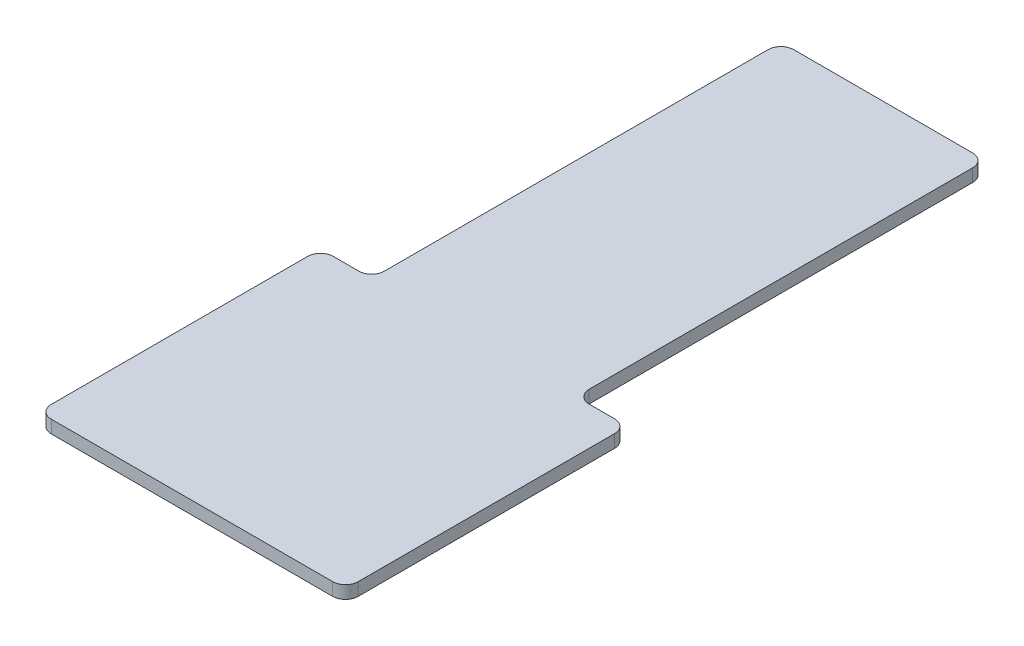
ISO-10303-21;
HEADER;
FILE_DESCRIPTION(('STEP AP214'),'2;1');
FILE_NAME('part.step','',(''),(''),'','','');
FILE_SCHEMA(('AUTOMOTIVE_DESIGN { 1 0 10303 214 1 1 1 1 }'));
ENDSEC;
DATA;
#1=APPLICATION_CONTEXT('core data for automotive mechanical design processes');
#2=APPLICATION_PROTOCOL_DEFINITION('international standard','automotive_design',2000,#1);
#3=PRODUCT_CONTEXT('',#1,'mechanical');
#4=PRODUCT('Part','Part','',(#3));
#5=PRODUCT_RELATED_PRODUCT_CATEGORY('part','',(#4));
#6=PRODUCT_DEFINITION_FORMATION('','',#4);
#7=PRODUCT_DEFINITION_CONTEXT('part definition',#1,'design');
#8=PRODUCT_DEFINITION('design','',#6,#7);
#9=PRODUCT_DEFINITION_SHAPE('','',#8);
#10=(LENGTH_UNIT() NAMED_UNIT(*) SI_UNIT(.MILLI.,.METRE.));
#11=(NAMED_UNIT(*) PLANE_ANGLE_UNIT() SI_UNIT($,.RADIAN.));
#12=(NAMED_UNIT(*) SI_UNIT($,.STERADIAN.) SOLID_ANGLE_UNIT());
#13=UNCERTAINTY_MEASURE_WITH_UNIT(LENGTH_MEASURE(1.E-05),#10,'distance_accuracy_value','');
#14=(GEOMETRIC_REPRESENTATION_CONTEXT(3) GLOBAL_UNCERTAINTY_ASSIGNED_CONTEXT((#13)) GLOBAL_UNIT_ASSIGNED_CONTEXT((#10,
#11,#12)) REPRESENTATION_CONTEXT('',''));
#15=CARTESIAN_POINT('',(0.,0.,0.));
#16=DIRECTION('',(0.,0.,1.));
#17=DIRECTION('',(1.,0.,0.));
#18=AXIS2_PLACEMENT_3D('',#15,#16,#17);
#19=CARTESIAN_POINT('',(0.,3.175,0.));
#20=DIRECTION('',(1.,0.,0.));
#21=DIRECTION('',(0.,0.,-1.));
#22=AXIS2_PLACEMENT_3D('',#19,#20,#21);
#23=PLANE('',#22);
#24=DIRECTION('',(0.,0.,1.));
#25=VECTOR('',#24,1.);
#26=CARTESIAN_POINT('',(0.,3.175,0.));
#27=LINE('',#26,#25);
#28=CARTESIAN_POINT('',(0.,3.175,-66.825));
#29=VERTEX_POINT('',#28);
#30=CARTESIAN_POINT('',(0.,3.175,-3.175));
#31=VERTEX_POINT('',#30);
#32=EDGE_CURVE('E172',#29,#31,#27,.T.);
#33=ORIENTED_EDGE('',*,*,#32,.F.);
#34=DIRECTION('',(0.,-1.,0.));
#35=VECTOR('',#34,1.);
#36=CARTESIAN_POINT('',(0.,3.175,-66.825));
#37=LINE('',#36,#35);
#38=CARTESIAN_POINT('',(0.,0.,-66.825));
#39=VERTEX_POINT('',#38);
#40=EDGE_CURVE('E157',#29,#39,#37,.T.);
#41=ORIENTED_EDGE('',*,*,#40,.T.);
#42=DIRECTION('',(0.,0.,1.));
#43=VECTOR('',#42,1.);
#44=CARTESIAN_POINT('',(0.,0.,0.));
#45=LINE('',#44,#43);
#46=CARTESIAN_POINT('',(0.,0.,-3.175));
#47=VERTEX_POINT('',#46);
#48=EDGE_CURVE('E169',#39,#47,#45,.T.);
#49=ORIENTED_EDGE('',*,*,#48,.T.);
#50=DIRECTION('',(0.,-1.,0.));
#51=VECTOR('',#50,1.);
#52=CARTESIAN_POINT('',(0.,3.175,-3.175));
#53=LINE('',#52,#51);
#54=EDGE_CURVE('E174',#47,#31,#53,.F.);
#55=ORIENTED_EDGE('',*,*,#54,.T.);
#56=EDGE_LOOP('',(#33,#41,#49,#55));
#57=FACE_BOUND('',#56,.T.);
#58=ADVANCED_FACE('F39',(#57),#23,.F.);
#59=CARTESIAN_POINT('',(0.,3.175,0.));
#60=DIRECTION('',(0.,0.,-1.));
#61=DIRECTION('',(-1.,0.,0.));
#62=AXIS2_PLACEMENT_3D('',#59,#60,#61);
#63=PLANE('',#62);
#64=DIRECTION('',(1.,0.,0.));
#65=VECTOR('',#64,1.);
#66=CARTESIAN_POINT('',(0.,0.,0.));
#67=LINE('',#66,#65);
#68=CARTESIAN_POINT('',(3.175,0.,0.));
#69=VERTEX_POINT('',#68);
#70=CARTESIAN_POINT('',(73.025,0.,0.));
#71=VERTEX_POINT('',#70);
#72=EDGE_CURVE('E179',#69,#71,#67,.T.);
#73=ORIENTED_EDGE('',*,*,#72,.T.);
#74=DIRECTION('',(0.,-1.,0.));
#75=VECTOR('',#74,1.);
#76=CARTESIAN_POINT('',(73.025,3.175,0.));
#77=LINE('',#76,#75);
#78=CARTESIAN_POINT('',(73.025,3.175,0.));
#79=VERTEX_POINT('',#78);
#80=EDGE_CURVE('E252',#71,#79,#77,.F.);
#81=ORIENTED_EDGE('',*,*,#80,.T.);
#82=DIRECTION('',(1.,0.,0.));
#83=VECTOR('',#82,1.);
#84=CARTESIAN_POINT('',(0.,3.175,0.));
#85=LINE('',#84,#83);
#86=CARTESIAN_POINT('',(3.175,3.175,0.));
#87=VERTEX_POINT('',#86);
#88=EDGE_CURVE('E387',#87,#79,#85,.T.);
#89=ORIENTED_EDGE('',*,*,#88,.F.);
#90=DIRECTION('',(0.,-1.,0.));
#91=VECTOR('',#90,1.);
#92=CARTESIAN_POINT('',(3.175,3.175,0.));
#93=LINE('',#92,#91);
#94=EDGE_CURVE('E249',#87,#69,#93,.T.);
#95=ORIENTED_EDGE('',*,*,#94,.T.);
#96=EDGE_LOOP('',(#73,#81,#89,#95));
#97=FACE_BOUND('',#96,.T.);
#98=ADVANCED_FACE('F316',(#97),#63,.F.);
#99=CARTESIAN_POINT('',(76.2,3.175,0.));
#100=DIRECTION('',(-1.,0.,0.));
#101=DIRECTION('',(0.,0.,1.));
#102=AXIS2_PLACEMENT_3D('',#99,#100,#101);
#103=PLANE('',#102);
#104=DIRECTION('',(0.,0.,-1.));
#105=VECTOR('',#104,1.);
#106=CARTESIAN_POINT('',(76.2,3.175,0.));
#107=LINE('',#106,#105);
#108=CARTESIAN_POINT('',(76.2,3.175,-3.175));
#109=VERTEX_POINT('',#108);
#110=CARTESIAN_POINT('',(76.2,3.175,-66.825));
#111=VERTEX_POINT('',#110);
#112=EDGE_CURVE('E283',#109,#111,#107,.T.);
#113=ORIENTED_EDGE('',*,*,#112,.F.);
#114=DIRECTION('',(0.,-1.,0.));
#115=VECTOR('',#114,1.);
#116=CARTESIAN_POINT('',(76.2,3.175,-3.175));
#117=LINE('',#116,#115);
#118=CARTESIAN_POINT('',(76.2,0.,-3.175));
#119=VERTEX_POINT('',#118);
#120=EDGE_CURVE('E246',#109,#119,#117,.T.);
#121=ORIENTED_EDGE('',*,*,#120,.T.);
#122=DIRECTION('',(0.,0.,-1.));
#123=VECTOR('',#122,1.);
#124=CARTESIAN_POINT('',(76.2,0.,0.));
#125=LINE('',#124,#123);
#126=CARTESIAN_POINT('',(76.2,0.,-66.825));
#127=VERTEX_POINT('',#126);
#128=EDGE_CURVE('E182',#119,#127,#125,.T.);
#129=ORIENTED_EDGE('',*,*,#128,.T.);
#130=DIRECTION('',(0.,-1.,0.));
#131=VECTOR('',#130,1.);
#132=CARTESIAN_POINT('',(76.2,3.175,-66.825));
#133=LINE('',#132,#131);
#134=EDGE_CURVE('E244',#127,#111,#133,.F.);
#135=ORIENTED_EDGE('',*,*,#134,.T.);
#136=EDGE_LOOP('',(#113,#121,#129,#135));
#137=FACE_BOUND('',#136,.T.);
#138=ADVANCED_FACE('F321',(#137),#103,.F.);
#139=CARTESIAN_POINT('',(63.5,3.175,-70.));
#140=DIRECTION('',(0.,0.,1.));
#141=DIRECTION('',(1.,0.,0.));
#142=AXIS2_PLACEMENT_3D('',#139,#140,#141);
#143=PLANE('',#142);
#144=DIRECTION('',(-1.,0.,0.));
#145=VECTOR('',#144,1.);
#146=CARTESIAN_POINT('',(63.5,0.,-70.));
#147=LINE('',#146,#145);
#148=CARTESIAN_POINT('',(73.025,0.,-70.));
#149=VERTEX_POINT('',#148);
#150=CARTESIAN_POINT('',(66.675,0.,-70.));
#151=VERTEX_POINT('',#150);
#152=EDGE_CURVE('E190',#149,#151,#147,.T.);
#153=ORIENTED_EDGE('',*,*,#152,.T.);
#154=DIRECTION('',(0.,-1.,0.));
#155=VECTOR('',#154,1.);
#156=CARTESIAN_POINT('',(66.675,3.175,-70.));
#157=LINE('',#156,#155);
#158=CARTESIAN_POINT('',(66.675,3.175,-70.));
#159=VERTEX_POINT('',#158);
#160=EDGE_CURVE('E242',#151,#159,#157,.F.);
#161=ORIENTED_EDGE('',*,*,#160,.T.);
#162=DIRECTION('',(-1.,0.,0.));
#163=VECTOR('',#162,1.);
#164=CARTESIAN_POINT('',(63.5,3.175,-70.));
#165=LINE('',#164,#163);
#166=CARTESIAN_POINT('',(73.025,3.175,-70.));
#167=VERTEX_POINT('',#166);
#168=EDGE_CURVE('E275',#167,#159,#165,.T.);
#169=ORIENTED_EDGE('',*,*,#168,.F.);
#170=DIRECTION('',(0.,-1.,0.));
#171=VECTOR('',#170,1.);
#172=CARTESIAN_POINT('',(73.025,3.175,-70.));
#173=LINE('',#172,#171);
#174=EDGE_CURVE('E239',#167,#149,#173,.T.);
#175=ORIENTED_EDGE('',*,*,#174,.T.);
#176=EDGE_LOOP('',(#153,#161,#169,#175));
#177=FACE_BOUND('',#176,.T.);
#178=ADVANCED_FACE('F263',(#177),#143,.F.);
#179=CARTESIAN_POINT('',(63.5,3.175,-70.));
#180=DIRECTION('',(-1.,0.,0.));
#181=DIRECTION('',(0.,0.,1.));
#182=AXIS2_PLACEMENT_3D('',#179,#180,#181);
#183=PLANE('',#182);
#184=DIRECTION('',(0.,0.,-1.));
#185=VECTOR('',#184,1.);
#186=CARTESIAN_POINT('',(63.5,0.,-70.));
#187=LINE('',#186,#185);
#188=CARTESIAN_POINT('',(63.5,0.,-73.175));
#189=VERTEX_POINT('',#188);
#190=CARTESIAN_POINT('',(63.5,0.,-168.425));
#191=VERTEX_POINT('',#190);
#192=EDGE_CURVE('E193',#189,#191,#187,.T.);
#193=ORIENTED_EDGE('',*,*,#192,.T.);
#194=DIRECTION('',(0.,-1.,0.));
#195=VECTOR('',#194,1.);
#196=CARTESIAN_POINT('',(63.5,3.175,-168.425));
#197=LINE('',#196,#195);
#198=CARTESIAN_POINT('',(63.5,3.175,-168.425));
#199=VERTEX_POINT('',#198);
#200=EDGE_CURVE('E237',#191,#199,#197,.F.);
#201=ORIENTED_EDGE('',*,*,#200,.T.);
#202=DIRECTION('',(0.,0.,-1.));
#203=VECTOR('',#202,1.);
#204=CARTESIAN_POINT('',(63.5,3.175,-70.));
#205=LINE('',#204,#203);
#206=CARTESIAN_POINT('',(63.5,3.175,-73.175));
#207=VERTEX_POINT('',#206);
#208=EDGE_CURVE('E273',#207,#199,#205,.T.);
#209=ORIENTED_EDGE('',*,*,#208,.F.);
#210=DIRECTION('',(0.,-1.,0.));
#211=VECTOR('',#210,1.);
#212=CARTESIAN_POINT('',(63.5,0.,-73.175));
#213=LINE('',#212,#211);
#214=EDGE_CURVE('E234',#207,#189,#213,.T.);
#215=ORIENTED_EDGE('',*,*,#214,.T.);
#216=EDGE_LOOP('',(#193,#201,#209,#215));
#217=FACE_BOUND('',#216,.T.);
#218=ADVANCED_FACE('F277',(#217),#183,.F.);
#219=CARTESIAN_POINT('',(12.7,3.175,-171.6));
#220=DIRECTION('',(0.,0.,1.));
#221=DIRECTION('',(1.,0.,0.));
#222=AXIS2_PLACEMENT_3D('',#219,#220,#221);
#223=PLANE('',#222);
#224=DIRECTION('',(-1.,0.,0.));
#225=VECTOR('',#224,1.);
#226=CARTESIAN_POINT('',(12.7,0.,-171.6));
#227=LINE('',#226,#225);
#228=CARTESIAN_POINT('',(60.325,0.,-171.6));
#229=VERTEX_POINT('',#228);
#230=CARTESIAN_POINT('',(15.875,0.,-171.6));
#231=VERTEX_POINT('',#230);
#232=EDGE_CURVE('E196',#229,#231,#227,.T.);
#233=ORIENTED_EDGE('',*,*,#232,.T.);
#234=DIRECTION('',(0.,-1.,0.));
#235=VECTOR('',#234,1.);
#236=CARTESIAN_POINT('',(15.875,3.175,-171.6));
#237=LINE('',#236,#235);
#238=CARTESIAN_POINT('',(15.875,3.175,-171.6));
#239=VERTEX_POINT('',#238);
#240=EDGE_CURVE('E232',#231,#239,#237,.F.);
#241=ORIENTED_EDGE('',*,*,#240,.T.);
#242=DIRECTION('',(-1.,0.,0.));
#243=VECTOR('',#242,1.);
#244=CARTESIAN_POINT('',(12.7,3.175,-171.6));
#245=LINE('',#244,#243);
#246=CARTESIAN_POINT('',(60.325,3.175,-171.6));
#247=VERTEX_POINT('',#246);
#248=EDGE_CURVE('E279',#247,#239,#245,.T.);
#249=ORIENTED_EDGE('',*,*,#248,.F.);
#250=DIRECTION('',(0.,-1.,0.));
#251=VECTOR('',#250,1.);
#252=CARTESIAN_POINT('',(60.325,3.175,-171.6));
#253=LINE('',#252,#251);
#254=EDGE_CURVE('E229',#247,#229,#253,.T.);
#255=ORIENTED_EDGE('',*,*,#254,.T.);
#256=EDGE_LOOP('',(#233,#241,#249,#255));
#257=FACE_BOUND('',#256,.T.);
#258=ADVANCED_FACE('F301',(#257),#223,.F.);
#259=CARTESIAN_POINT('',(12.7,3.175,-70.));
#260=DIRECTION('',(1.,0.,0.));
#261=DIRECTION('',(0.,0.,-1.));
#262=AXIS2_PLACEMENT_3D('',#259,#260,#261);
#263=PLANE('',#262);
#264=DIRECTION('',(0.,0.,1.));
#265=VECTOR('',#264,1.);
#266=CARTESIAN_POINT('',(12.7,0.,-70.));
#267=LINE('',#266,#265);
#268=CARTESIAN_POINT('',(12.7,0.,-168.425));
#269=VERTEX_POINT('',#268);
#270=CARTESIAN_POINT('',(12.7,0.,-73.175));
#271=VERTEX_POINT('',#270);
#272=EDGE_CURVE('E199',#269,#271,#267,.T.);
#273=ORIENTED_EDGE('',*,*,#272,.T.);
#274=DIRECTION('',(0.,-1.,0.));
#275=VECTOR('',#274,1.);
#276=CARTESIAN_POINT('',(12.7,3.175,-73.175));
#277=LINE('',#276,#275);
#278=CARTESIAN_POINT('',(12.7,3.175,-73.175));
#279=VERTEX_POINT('',#278);
#280=EDGE_CURVE('E54',#271,#279,#277,.F.);
#281=ORIENTED_EDGE('',*,*,#280,.T.);
#282=DIRECTION('',(0.,0.,1.));
#283=VECTOR('',#282,1.);
#284=CARTESIAN_POINT('',(12.7,3.175,-70.));
#285=LINE('',#284,#283);
#286=CARTESIAN_POINT('',(12.7,3.175,-168.425));
#287=VERTEX_POINT('',#286);
#288=EDGE_CURVE('E281',#287,#279,#285,.T.);
#289=ORIENTED_EDGE('',*,*,#288,.F.);
#290=DIRECTION('',(0.,-1.,0.));
#291=VECTOR('',#290,1.);
#292=CARTESIAN_POINT('',(12.7,3.175,-168.425));
#293=LINE('',#292,#291);
#294=EDGE_CURVE('E225',#287,#269,#293,.T.);
#295=ORIENTED_EDGE('',*,*,#294,.T.);
#296=EDGE_LOOP('',(#273,#281,#289,#295));
#297=FACE_BOUND('',#296,.T.);
#298=ADVANCED_FACE('F294',(#297),#263,.F.);
#299=CARTESIAN_POINT('',(0.,3.175,-70.));
#300=DIRECTION('',(0.,0.,1.));
#301=DIRECTION('',(1.,0.,0.));
#302=AXIS2_PLACEMENT_3D('',#299,#300,#301);
#303=PLANE('',#302);
#304=DIRECTION('',(-1.,0.,0.));
#305=VECTOR('',#304,1.);
#306=CARTESIAN_POINT('',(0.,0.,-70.));
#307=LINE('',#306,#305);
#308=CARTESIAN_POINT('',(9.525,0.,-70.));
#309=VERTEX_POINT('',#308);
#310=CARTESIAN_POINT('',(3.175,0.,-70.));
#311=VERTEX_POINT('',#310);
#312=EDGE_CURVE('E201',#309,#311,#307,.T.);
#313=ORIENTED_EDGE('',*,*,#312,.T.);
#314=DIRECTION('',(0.,-1.,0.));
#315=VECTOR('',#314,1.);
#316=CARTESIAN_POINT('',(3.175,3.175,-70.));
#317=LINE('',#316,#315);
#318=CARTESIAN_POINT('',(3.175,3.175,-70.));
#319=VERTEX_POINT('',#318);
#320=EDGE_CURVE('E158',#311,#319,#317,.F.);
#321=ORIENTED_EDGE('',*,*,#320,.T.);
#322=DIRECTION('',(-1.,0.,0.));
#323=VECTOR('',#322,1.);
#324=CARTESIAN_POINT('',(0.,3.175,-70.));
#325=LINE('',#324,#323);
#326=CARTESIAN_POINT('',(9.525,3.175,-70.));
#327=VERTEX_POINT('',#326);
#328=EDGE_CURVE('E185',#327,#319,#325,.T.);
#329=ORIENTED_EDGE('',*,*,#328,.F.);
#330=DIRECTION('',(0.,-1.,0.));
#331=VECTOR('',#330,1.);
#332=CARTESIAN_POINT('',(9.525,0.,-70.));
#333=LINE('',#332,#331);
#334=EDGE_CURVE('E163',#327,#309,#333,.T.);
#335=ORIENTED_EDGE('',*,*,#334,.T.);
#336=EDGE_LOOP('',(#313,#321,#329,#335));
#337=FACE_BOUND('',#336,.T.);
#338=ADVANCED_FACE('F290',(#337),#303,.F.);
#339=CARTESIAN_POINT('',(0.,3.175,0.));
#340=DIRECTION('',(0.,-1.,0.));
#341=DIRECTION('',(0.,0.,-1.));
#342=AXIS2_PLACEMENT_3D('',#339,#340,#341);
#343=PLANE('',#342);
#344=ORIENTED_EDGE('',*,*,#328,.T.);
#345=CARTESIAN_POINT('',(3.175,3.175,-66.825));
#346=DIRECTION('',(0.,-1.,0.));
#347=DIRECTION('',(0.,0.,-1.));
#348=AXIS2_PLACEMENT_3D('',#345,#346,#347);
#349=CIRCLE('',#348,3.175);
#350=EDGE_CURVE('E223',#319,#29,#349,.F.);
#351=ORIENTED_EDGE('',*,*,#350,.T.);
#352=ORIENTED_EDGE('',*,*,#32,.T.);
#353=CARTESIAN_POINT('',(3.175,3.175,-3.175));
#354=DIRECTION('',(0.,-1.,0.));
#355=DIRECTION('',(0.,0.,-1.));
#356=AXIS2_PLACEMENT_3D('',#353,#354,#355);
#357=CIRCLE('',#356,3.175);
#358=EDGE_CURVE('E216',#31,#87,#357,.F.);
#359=ORIENTED_EDGE('',*,*,#358,.T.);
#360=ORIENTED_EDGE('',*,*,#88,.T.);
#361=CARTESIAN_POINT('',(73.025,3.175,-3.175));
#362=DIRECTION('',(0.,-1.,0.));
#363=DIRECTION('',(0.,0.,-1.));
#364=AXIS2_PLACEMENT_3D('',#361,#362,#363);
#365=CIRCLE('',#364,3.175);
#366=EDGE_CURVE('E218',#79,#109,#365,.F.);
#367=ORIENTED_EDGE('',*,*,#366,.T.);
#368=ORIENTED_EDGE('',*,*,#112,.T.);
#369=CARTESIAN_POINT('',(73.025,3.175,-66.825));
#370=DIRECTION('',(0.,-1.,0.));
#371=DIRECTION('',(0.,0.,-1.));
#372=AXIS2_PLACEMENT_3D('',#369,#370,#371);
#373=CIRCLE('',#372,3.175);
#374=EDGE_CURVE('E214',#111,#167,#373,.F.);
#375=ORIENTED_EDGE('',*,*,#374,.T.);
#376=ORIENTED_EDGE('',*,*,#168,.T.);
#377=CARTESIAN_POINT('',(66.675,3.175,-73.175));
#378=DIRECTION('',(0.,-1.,0.));
#379=DIRECTION('',(0.,0.,-1.));
#380=AXIS2_PLACEMENT_3D('',#377,#378,#379);
#381=CIRCLE('',#380,3.175);
#382=EDGE_CURVE('E11',#159,#207,#381,.T.);
#383=ORIENTED_EDGE('',*,*,#382,.T.);
#384=ORIENTED_EDGE('',*,*,#208,.T.);
#385=CARTESIAN_POINT('',(60.325,3.175,-168.425));
#386=DIRECTION('',(0.,-1.,0.));
#387=DIRECTION('',(0.,0.,-1.));
#388=AXIS2_PLACEMENT_3D('',#385,#386,#387);
#389=CIRCLE('',#388,3.175);
#390=EDGE_CURVE('E220',#199,#247,#389,.F.);
#391=ORIENTED_EDGE('',*,*,#390,.T.);
#392=ORIENTED_EDGE('',*,*,#248,.T.);
#393=CARTESIAN_POINT('',(15.875,3.175,-168.425));
#394=DIRECTION('',(0.,-1.,0.));
#395=DIRECTION('',(0.,0.,-1.));
#396=AXIS2_PLACEMENT_3D('',#393,#394,#395);
#397=CIRCLE('',#396,3.175);
#398=EDGE_CURVE('E61',#239,#287,#397,.F.);
#399=ORIENTED_EDGE('',*,*,#398,.T.);
#400=ORIENTED_EDGE('',*,*,#288,.T.);
#401=CARTESIAN_POINT('',(9.525,3.175,-73.175));
#402=DIRECTION('',(0.,-1.,0.));
#403=DIRECTION('',(0.,0.,-1.));
#404=AXIS2_PLACEMENT_3D('',#401,#402,#403);
#405=CIRCLE('',#404,3.175);
#406=EDGE_CURVE('E256',#279,#327,#405,.T.);
#407=ORIENTED_EDGE('',*,*,#406,.T.);
#408=EDGE_LOOP('',(#344,#351,#352,#359,#360,#367,#368,#375,#376,#383,#384,#391,#392,#399,#400,#407));
#409=FACE_BOUND('',#408,.T.);
#410=ADVANCED_FACE('F272',(#409),#343,.F.);
#411=CARTESIAN_POINT('',(0.,0.,0.));
#412=DIRECTION('',(0.,-1.,0.));
#413=DIRECTION('',(0.,0.,-1.));
#414=AXIS2_PLACEMENT_3D('',#411,#412,#413);
#415=PLANE('',#414);
#416=ORIENTED_EDGE('',*,*,#48,.F.);
#417=CARTESIAN_POINT('',(3.175,0.,-66.825));
#418=DIRECTION('',(0.,-1.,0.));
#419=DIRECTION('',(0.,0.,-1.));
#420=AXIS2_PLACEMENT_3D('',#417,#418,#419);
#421=CIRCLE('',#420,3.175);
#422=EDGE_CURVE('E153',#39,#311,#421,.T.);
#423=ORIENTED_EDGE('',*,*,#422,.T.);
#424=ORIENTED_EDGE('',*,*,#312,.F.);
#425=CARTESIAN_POINT('',(9.525,0.,-73.175));
#426=DIRECTION('',(0.,-1.,0.));
#427=DIRECTION('',(0.,0.,-1.));
#428=AXIS2_PLACEMENT_3D('',#425,#426,#427);
#429=CIRCLE('',#428,3.175);
#430=EDGE_CURVE('E254',#309,#271,#429,.F.);
#431=ORIENTED_EDGE('',*,*,#430,.T.);
#432=ORIENTED_EDGE('',*,*,#272,.F.);
#433=CARTESIAN_POINT('',(15.875,0.,-168.425));
#434=DIRECTION('',(0.,-1.,0.));
#435=DIRECTION('',(0.,0.,-1.));
#436=AXIS2_PLACEMENT_3D('',#433,#434,#435);
#437=CIRCLE('',#436,3.175);
#438=EDGE_CURVE('E164',#269,#231,#437,.T.);
#439=ORIENTED_EDGE('',*,*,#438,.T.);
#440=ORIENTED_EDGE('',*,*,#232,.F.);
#441=CARTESIAN_POINT('',(60.325,0.,-168.425));
#442=DIRECTION('',(0.,-1.,0.));
#443=DIRECTION('',(0.,0.,-1.));
#444=AXIS2_PLACEMENT_3D('',#441,#442,#443);
#445=CIRCLE('',#444,3.175);
#446=EDGE_CURVE('E208',#229,#191,#445,.T.);
#447=ORIENTED_EDGE('',*,*,#446,.T.);
#448=ORIENTED_EDGE('',*,*,#192,.F.);
#449=CARTESIAN_POINT('',(66.675,0.,-73.175));
#450=DIRECTION('',(0.,-1.,0.));
#451=DIRECTION('',(0.,0.,-1.));
#452=AXIS2_PLACEMENT_3D('',#449,#450,#451);
#453=CIRCLE('',#452,3.175);
#454=EDGE_CURVE('E47',#189,#151,#453,.F.);
#455=ORIENTED_EDGE('',*,*,#454,.T.);
#456=ORIENTED_EDGE('',*,*,#152,.F.);
#457=CARTESIAN_POINT('',(73.025,0.,-66.825));
#458=DIRECTION('',(0.,-1.,0.));
#459=DIRECTION('',(0.,0.,-1.));
#460=AXIS2_PLACEMENT_3D('',#457,#458,#459);
#461=CIRCLE('',#460,3.175);
#462=EDGE_CURVE('E173',#149,#127,#461,.T.);
#463=ORIENTED_EDGE('',*,*,#462,.T.);
#464=ORIENTED_EDGE('',*,*,#128,.F.);
#465=CARTESIAN_POINT('',(73.025,0.,-3.175));
#466=DIRECTION('',(0.,-1.,0.));
#467=DIRECTION('',(0.,0.,-1.));
#468=AXIS2_PLACEMENT_3D('',#465,#466,#467);
#469=CIRCLE('',#468,3.175);
#470=EDGE_CURVE('E206',#119,#71,#469,.T.);
#471=ORIENTED_EDGE('',*,*,#470,.T.);
#472=ORIENTED_EDGE('',*,*,#72,.F.);
#473=CARTESIAN_POINT('',(3.175,0.,-3.175));
#474=DIRECTION('',(0.,-1.,0.));
#475=DIRECTION('',(0.,0.,-1.));
#476=AXIS2_PLACEMENT_3D('',#473,#474,#475);
#477=CIRCLE('',#476,3.175);
#478=EDGE_CURVE('E178',#69,#47,#477,.T.);
#479=ORIENTED_EDGE('',*,*,#478,.T.);
#480=EDGE_LOOP('',(#416,#423,#424,#431,#432,#439,#440,#447,#448,#455,#456,#463,#464,#471,#472,#479));
#481=FACE_BOUND('',#480,.T.);
#482=ADVANCED_FACE('F176',(#481),#415,.T.);
#483=CARTESIAN_POINT('',(3.175,3.175,-66.825));
#484=DIRECTION('',(0.,-1.,0.));
#485=DIRECTION('',(0.,0.,-1.));
#486=AXIS2_PLACEMENT_3D('',#483,#484,#485);
#487=CYLINDRICAL_SURFACE('',#486,3.175);
#488=ORIENTED_EDGE('',*,*,#350,.F.);
#489=ORIENTED_EDGE('',*,*,#320,.F.);
#490=ORIENTED_EDGE('',*,*,#422,.F.);
#491=ORIENTED_EDGE('',*,*,#40,.F.);
#492=EDGE_LOOP('',(#488,#489,#490,#491));
#493=FACE_BOUND('',#492,.T.);
#494=ADVANCED_FACE('F156',(#493),#487,.T.);
#495=CARTESIAN_POINT('',(9.525,3.175,-73.175));
#496=DIRECTION('',(0.,1.,0.));
#497=DIRECTION('',(0.,0.,1.));
#498=AXIS2_PLACEMENT_3D('',#495,#496,#497);
#499=CYLINDRICAL_SURFACE('',#498,3.175);
#500=ORIENTED_EDGE('',*,*,#406,.F.);
#501=ORIENTED_EDGE('',*,*,#280,.F.);
#502=ORIENTED_EDGE('',*,*,#430,.F.);
#503=ORIENTED_EDGE('',*,*,#334,.F.);
#504=EDGE_LOOP('',(#500,#501,#502,#503));
#505=FACE_BOUND('',#504,.T.);
#506=ADVANCED_FACE('F292',(#505),#499,.F.);
#507=CARTESIAN_POINT('',(15.875,3.175,-168.425));
#508=DIRECTION('',(0.,-1.,0.));
#509=DIRECTION('',(0.,0.,-1.));
#510=AXIS2_PLACEMENT_3D('',#507,#508,#509);
#511=CYLINDRICAL_SURFACE('',#510,3.175);
#512=ORIENTED_EDGE('',*,*,#398,.F.);
#513=ORIENTED_EDGE('',*,*,#240,.F.);
#514=ORIENTED_EDGE('',*,*,#438,.F.);
#515=ORIENTED_EDGE('',*,*,#294,.F.);
#516=EDGE_LOOP('',(#512,#513,#514,#515));
#517=FACE_BOUND('',#516,.T.);
#518=ADVANCED_FACE('F297',(#517),#511,.T.);
#519=CARTESIAN_POINT('',(60.325,3.175,-168.425));
#520=DIRECTION('',(0.,-1.,0.));
#521=DIRECTION('',(0.,0.,-1.));
#522=AXIS2_PLACEMENT_3D('',#519,#520,#521);
#523=CYLINDRICAL_SURFACE('',#522,3.175);
#524=ORIENTED_EDGE('',*,*,#390,.F.);
#525=ORIENTED_EDGE('',*,*,#200,.F.);
#526=ORIENTED_EDGE('',*,*,#446,.F.);
#527=ORIENTED_EDGE('',*,*,#254,.F.);
#528=EDGE_LOOP('',(#524,#525,#526,#527));
#529=FACE_BOUND('',#528,.T.);
#530=ADVANCED_FACE('F305',(#529),#523,.T.);
#531=CARTESIAN_POINT('',(66.675,3.175,-73.175));
#532=DIRECTION('',(0.,1.,0.));
#533=DIRECTION('',(0.,0.,1.));
#534=AXIS2_PLACEMENT_3D('',#531,#532,#533);
#535=CYLINDRICAL_SURFACE('',#534,3.175);
#536=ORIENTED_EDGE('',*,*,#382,.F.);
#537=ORIENTED_EDGE('',*,*,#160,.F.);
#538=ORIENTED_EDGE('',*,*,#454,.F.);
#539=ORIENTED_EDGE('',*,*,#214,.F.);
#540=EDGE_LOOP('',(#536,#537,#538,#539));
#541=FACE_BOUND('',#540,.T.);
#542=ADVANCED_FACE('F268',(#541),#535,.F.);
#543=CARTESIAN_POINT('',(73.025,3.175,-3.175));
#544=DIRECTION('',(0.,-1.,0.));
#545=DIRECTION('',(0.,0.,-1.));
#546=AXIS2_PLACEMENT_3D('',#543,#544,#545);
#547=CYLINDRICAL_SURFACE('',#546,3.175);
#548=ORIENTED_EDGE('',*,*,#366,.F.);
#549=ORIENTED_EDGE('',*,*,#80,.F.);
#550=ORIENTED_EDGE('',*,*,#470,.F.);
#551=ORIENTED_EDGE('',*,*,#120,.F.);
#552=EDGE_LOOP('',(#548,#549,#550,#551));
#553=FACE_BOUND('',#552,.T.);
#554=ADVANCED_FACE('F312',(#553),#547,.T.);
#555=CARTESIAN_POINT('',(3.175,3.175,-3.175));
#556=DIRECTION('',(0.,-1.,0.));
#557=DIRECTION('',(0.,0.,-1.));
#558=AXIS2_PLACEMENT_3D('',#555,#556,#557);
#559=CYLINDRICAL_SURFACE('',#558,3.175);
#560=ORIENTED_EDGE('',*,*,#358,.F.);
#561=ORIENTED_EDGE('',*,*,#54,.F.);
#562=ORIENTED_EDGE('',*,*,#478,.F.);
#563=ORIENTED_EDGE('',*,*,#94,.F.);
#564=EDGE_LOOP('',(#560,#561,#562,#563));
#565=FACE_BOUND('',#564,.T.);
#566=ADVANCED_FACE('F359',(#565),#559,.T.);
#567=CARTESIAN_POINT('',(73.025,3.175,-66.825));
#568=DIRECTION('',(0.,-1.,0.));
#569=DIRECTION('',(0.,0.,-1.));
#570=AXIS2_PLACEMENT_3D('',#567,#568,#569);
#571=CYLINDRICAL_SURFACE('',#570,3.175);
#572=ORIENTED_EDGE('',*,*,#374,.F.);
#573=ORIENTED_EDGE('',*,*,#134,.F.);
#574=ORIENTED_EDGE('',*,*,#462,.F.);
#575=ORIENTED_EDGE('',*,*,#174,.F.);
#576=EDGE_LOOP('',(#572,#573,#574,#575));
#577=FACE_BOUND('',#576,.T.);
#578=ADVANCED_FACE('F41',(#577),#571,.T.);
#579=CLOSED_SHELL('',(#58,#98,#138,#178,#218,#258,#298,#338,#410,#482,#494,#506,#518,#530,#542,
#554,#566,#578));
#580=MANIFOLD_SOLID_BREP('B2',#579);
#581=ADVANCED_BREP_SHAPE_REPRESENTATION('',(#18,#580),#14);
#582=SHAPE_DEFINITION_REPRESENTATION(#9,#581);
ENDSEC;
END-ISO-10303-21;
